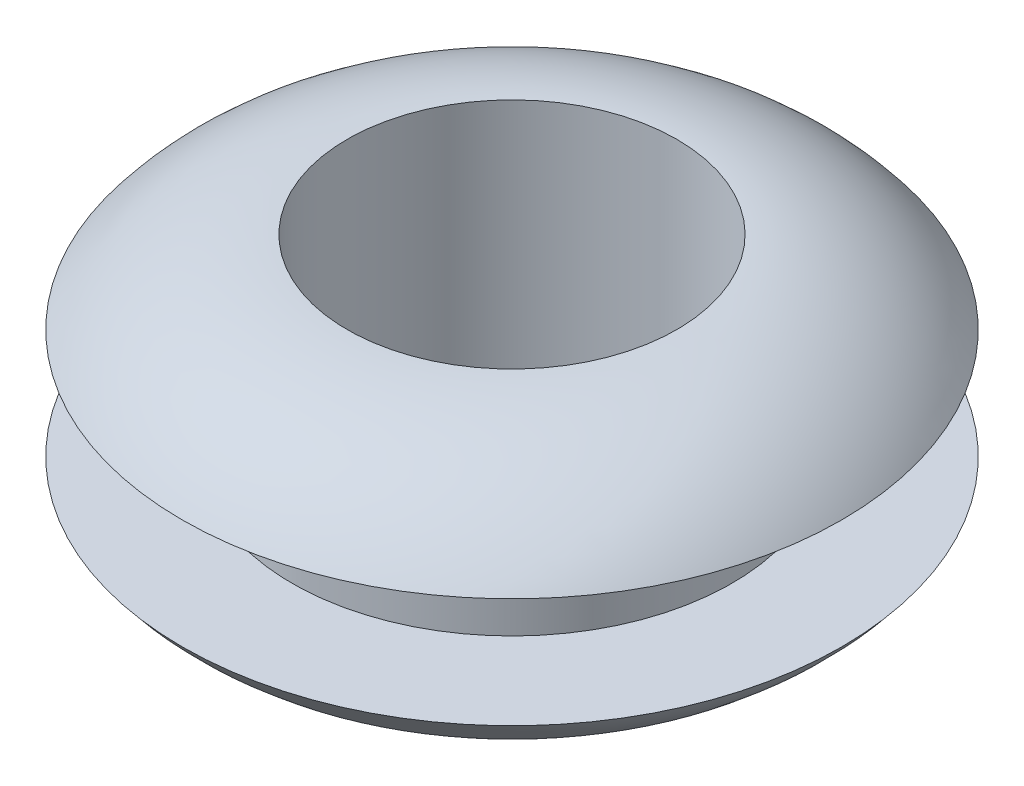
ISO-10303-21;
HEADER;
FILE_DESCRIPTION(('STEP AP214'),'2;1');
FILE_NAME('part.step','',(''),(''),'','','');
FILE_SCHEMA(('AUTOMOTIVE_DESIGN { 1 0 10303 214 1 1 1 1 }'));
ENDSEC;
DATA;
#1=APPLICATION_CONTEXT('core data for automotive mechanical design processes');
#2=APPLICATION_PROTOCOL_DEFINITION('international standard','automotive_design',2000,#1);
#3=PRODUCT_CONTEXT('',#1,'mechanical');
#4=PRODUCT('Part','Part','',(#3));
#5=PRODUCT_RELATED_PRODUCT_CATEGORY('part','',(#4));
#6=PRODUCT_DEFINITION_FORMATION('','',#4);
#7=PRODUCT_DEFINITION_CONTEXT('part definition',#1,'design');
#8=PRODUCT_DEFINITION('design','',#6,#7);
#9=PRODUCT_DEFINITION_SHAPE('','',#8);
#10=(LENGTH_UNIT() NAMED_UNIT(*) SI_UNIT(.MILLI.,.METRE.));
#11=(NAMED_UNIT(*) PLANE_ANGLE_UNIT() SI_UNIT($,.RADIAN.));
#12=(NAMED_UNIT(*) SI_UNIT($,.STERADIAN.) SOLID_ANGLE_UNIT());
#13=UNCERTAINTY_MEASURE_WITH_UNIT(LENGTH_MEASURE(1.E-05),#10,'distance_accuracy_value','');
#14=(GEOMETRIC_REPRESENTATION_CONTEXT(3) GLOBAL_UNCERTAINTY_ASSIGNED_CONTEXT((#13)) GLOBAL_UNIT_ASSIGNED_CONTEXT((#10,
#11,#12)) REPRESENTATION_CONTEXT('',''));
#15=CARTESIAN_POINT('',(0.,0.,0.));
#16=DIRECTION('',(0.,0.,1.));
#17=DIRECTION('',(1.,0.,0.));
#18=AXIS2_PLACEMENT_3D('',#15,#16,#17);
#19=CARTESIAN_POINT('',(0.,-1.28964893062525,0.));
#20=DIRECTION('',(0.,-1.,0.));
#21=DIRECTION('',(0.,0.,-1.));
#22=AXIS2_PLACEMENT_3D('',#19,#20,#21);
#23=DEGENERATE_TOROIDAL_SURFACE('',#22,2.98017553468738,3.78970078328277,.T.);
#24=CARTESIAN_POINT('',(0.,1.,0.));
#25=DIRECTION('',(0.,-1.,0.));
#26=DIRECTION('',(0.,0.,-1.));
#27=AXIS2_PLACEMENT_3D('',#24,#25,#26);
#28=CIRCLE('',#27,6.);
#29=CARTESIAN_POINT('',(0.,1.,-6.));
#30=VERTEX_POINT('',#29);
#31=EDGE_CURVE('E10',#30,#30,#28,.T.);
#32=ORIENTED_EDGE('',*,*,#31,.F.);
#33=EDGE_LOOP('',(#32));
#34=FACE_BOUND('',#33,.T.);
#35=CARTESIAN_POINT('',(0.,2.5,0.));
#36=DIRECTION('',(0.,-1.,0.));
#37=DIRECTION('',(0.,0.,-1.));
#38=AXIS2_PLACEMENT_3D('',#35,#36,#37);
#39=CIRCLE('',#38,3.);
#40=CARTESIAN_POINT('',(0.,2.5,-3.));
#41=VERTEX_POINT('',#40);
#42=EDGE_CURVE('E64',#41,#41,#39,.T.);
#43=ORIENTED_EDGE('',*,*,#42,.T.);
#44=EDGE_LOOP('',(#43));
#45=FACE_BOUND('',#44,.T.);
#46=ADVANCED_FACE('F37',(#34,#45),#23,.T.);
#47=CARTESIAN_POINT('',(-6.,1.,0.));
#48=DIRECTION('',(0.,1.,0.));
#49=DIRECTION('',(0.,0.,1.));
#50=AXIS2_PLACEMENT_3D('',#47,#48,#49);
#51=PLANE('',#50);
#52=CARTESIAN_POINT('',(0.,0.999999999999999,0.));
#53=DIRECTION('',(0.,-1.,0.));
#54=DIRECTION('',(0.,0.,-1.));
#55=AXIS2_PLACEMENT_3D('',#52,#53,#54);
#56=CIRCLE('',#55,4.);
#57=CARTESIAN_POINT('',(0.,0.999999999999999,-4.));
#58=VERTEX_POINT('',#57);
#59=EDGE_CURVE('E44',#58,#58,#56,.T.);
#60=ORIENTED_EDGE('',*,*,#59,.F.);
#61=EDGE_LOOP('',(#60));
#62=FACE_BOUND('',#61,.T.);
#63=ORIENTED_EDGE('',*,*,#31,.T.);
#64=EDGE_LOOP('',(#63));
#65=FACE_BOUND('',#64,.T.);
#66=ADVANCED_FACE('F90',(#62,#65),#51,.F.);
#67=CARTESIAN_POINT('',(0.,0.,0.));
#68=DIRECTION('',(0.,-1.,0.));
#69=DIRECTION('',(0.,0.,-1.));
#70=AXIS2_PLACEMENT_3D('',#67,#68,#69);
#71=CYLINDRICAL_SURFACE('',#70,4.);
#72=CARTESIAN_POINT('',(0.,-1.,0.));
#73=DIRECTION('',(0.,-1.,0.));
#74=DIRECTION('',(0.,0.,-1.));
#75=AXIS2_PLACEMENT_3D('',#72,#73,#74);
#76=CIRCLE('',#75,4.);
#77=CARTESIAN_POINT('',(0.,-1.,-4.));
#78=VERTEX_POINT('',#77);
#79=EDGE_CURVE('E49',#78,#78,#76,.T.);
#80=ORIENTED_EDGE('',*,*,#79,.F.);
#81=EDGE_LOOP('',(#80));
#82=FACE_BOUND('',#81,.T.);
#83=ORIENTED_EDGE('',*,*,#59,.T.);
#84=EDGE_LOOP('',(#83));
#85=FACE_BOUND('',#84,.T.);
#86=ADVANCED_FACE('F85',(#82,#85),#71,.T.);
#87=CARTESIAN_POINT('',(-6.,-1.,0.));
#88=DIRECTION('',(0.,-1.,0.));
#89=DIRECTION('',(0.,0.,-1.));
#90=AXIS2_PLACEMENT_3D('',#87,#88,#89);
#91=PLANE('',#90);
#92=CARTESIAN_POINT('',(0.,-1.,0.));
#93=DIRECTION('',(0.,-1.,0.));
#94=DIRECTION('',(0.,0.,-1.));
#95=AXIS2_PLACEMENT_3D('',#92,#93,#94);
#96=CIRCLE('',#95,6.);
#97=CARTESIAN_POINT('',(0.,-1.,-6.));
#98=VERTEX_POINT('',#97);
#99=EDGE_CURVE('E54',#98,#98,#96,.T.);
#100=ORIENTED_EDGE('',*,*,#99,.F.);
#101=EDGE_LOOP('',(#100));
#102=FACE_BOUND('',#101,.T.);
#103=ORIENTED_EDGE('',*,*,#79,.T.);
#104=EDGE_LOOP('',(#103));
#105=FACE_BOUND('',#104,.T.);
#106=ADVANCED_FACE('F79',(#102,#105),#91,.F.);
#107=CARTESIAN_POINT('',(0.,1.28964893062525,0.));
#108=DIRECTION('',(0.,-1.,0.));
#109=DIRECTION('',(0.,0.,-1.));
#110=AXIS2_PLACEMENT_3D('',#107,#108,#109);
#111=DEGENERATE_TOROIDAL_SURFACE('',#110,2.98017553468738,3.78970078328277,.T.);
#112=CARTESIAN_POINT('',(0.,-2.5,0.));
#113=DIRECTION('',(0.,-1.,0.));
#114=DIRECTION('',(0.,0.,-1.));
#115=AXIS2_PLACEMENT_3D('',#112,#113,#114);
#116=CIRCLE('',#115,3.);
#117=CARTESIAN_POINT('',(0.,-2.5,-3.));
#118=VERTEX_POINT('',#117);
#119=EDGE_CURVE('E60',#118,#118,#116,.T.);
#120=ORIENTED_EDGE('',*,*,#119,.F.);
#121=EDGE_LOOP('',(#120));
#122=FACE_BOUND('',#121,.T.);
#123=ORIENTED_EDGE('',*,*,#99,.T.);
#124=EDGE_LOOP('',(#123));
#125=FACE_BOUND('',#124,.T.);
#126=ADVANCED_FACE('F73',(#122,#125),#111,.T.);
#127=CARTESIAN_POINT('',(0.,0.,0.));
#128=DIRECTION('',(0.,-1.,0.));
#129=DIRECTION('',(0.,0.,-1.));
#130=AXIS2_PLACEMENT_3D('',#127,#128,#129);
#131=CYLINDRICAL_SURFACE('',#130,3.);
#132=ORIENTED_EDGE('',*,*,#42,.F.);
#133=EDGE_LOOP('',(#132));
#134=FACE_BOUND('',#133,.T.);
#135=ORIENTED_EDGE('',*,*,#119,.T.);
#136=EDGE_LOOP('',(#135));
#137=FACE_BOUND('',#136,.T.);
#138=ADVANCED_FACE('F70',(#134,#137),#131,.F.);
#139=CLOSED_SHELL('',(#46,#66,#86,#106,#126,#138));
#140=MANIFOLD_SOLID_BREP('B2',#139);
#141=ADVANCED_BREP_SHAPE_REPRESENTATION('',(#18,#140),#14);
#142=SHAPE_DEFINITION_REPRESENTATION(#9,#141);
ENDSEC;
END-ISO-10303-21;
